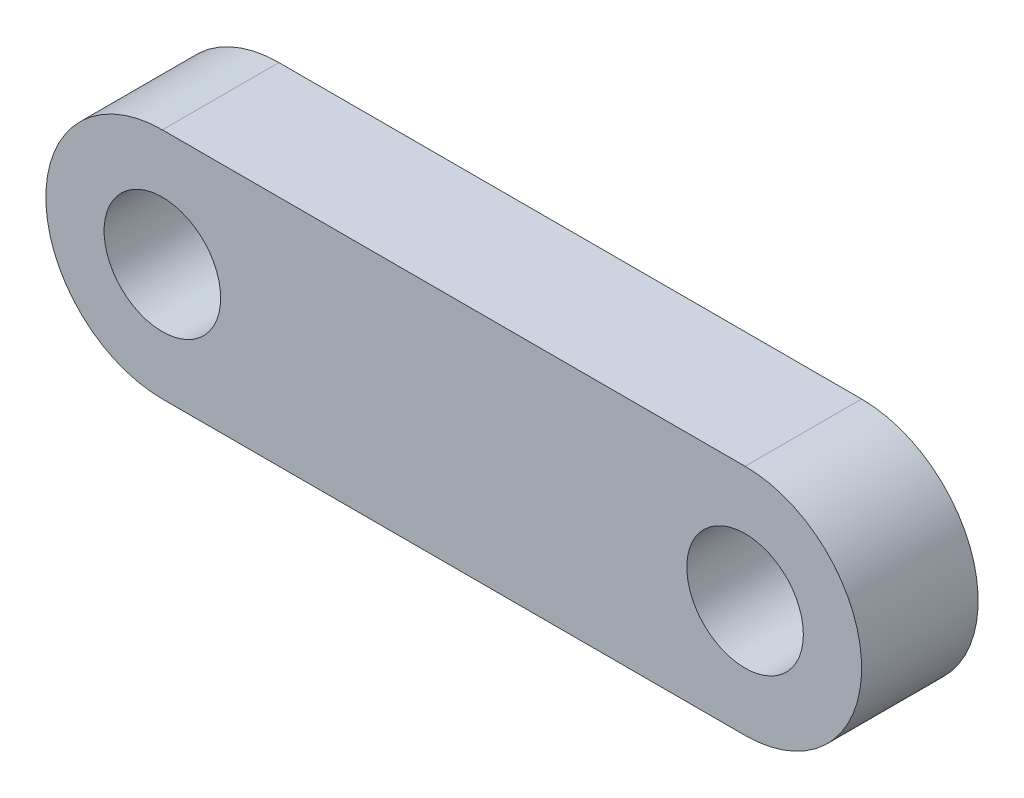
ISO-10303-21;
HEADER;
FILE_DESCRIPTION(('STEP AP214'),'2;1');
FILE_NAME('part.step','',(''),(''),'','','');
FILE_SCHEMA(('AUTOMOTIVE_DESIGN { 1 0 10303 214 1 1 1 1 }'));
ENDSEC;
DATA;
#1=APPLICATION_CONTEXT('core data for automotive mechanical design processes');
#2=APPLICATION_PROTOCOL_DEFINITION('international standard','automotive_design',2000,#1);
#3=PRODUCT_CONTEXT('',#1,'mechanical');
#4=PRODUCT('Part','Part','',(#3));
#5=PRODUCT_RELATED_PRODUCT_CATEGORY('part','',(#4));
#6=PRODUCT_DEFINITION_FORMATION('','',#4);
#7=PRODUCT_DEFINITION_CONTEXT('part definition',#1,'design');
#8=PRODUCT_DEFINITION('design','',#6,#7);
#9=PRODUCT_DEFINITION_SHAPE('','',#8);
#10=(LENGTH_UNIT() NAMED_UNIT(*) SI_UNIT(.MILLI.,.METRE.));
#11=(NAMED_UNIT(*) PLANE_ANGLE_UNIT() SI_UNIT($,.RADIAN.));
#12=(NAMED_UNIT(*) SI_UNIT($,.STERADIAN.) SOLID_ANGLE_UNIT());
#13=UNCERTAINTY_MEASURE_WITH_UNIT(LENGTH_MEASURE(1.E-05),#10,'distance_accuracy_value','');
#14=(GEOMETRIC_REPRESENTATION_CONTEXT(3) GLOBAL_UNCERTAINTY_ASSIGNED_CONTEXT((#13)) GLOBAL_UNIT_ASSIGNED_CONTEXT((#10,
#11,#12)) REPRESENTATION_CONTEXT('',''));
#15=CARTESIAN_POINT('',(0.,0.,0.));
#16=DIRECTION('',(0.,0.,1.));
#17=DIRECTION('',(1.,0.,0.));
#18=AXIS2_PLACEMENT_3D('',#15,#16,#17);
#19=CARTESIAN_POINT('',(-4.99999999334424,0.000257987588237606,2.));
#20=DIRECTION('',(0.,0.,1.));
#21=DIRECTION('',(1.,0.,0.));
#22=AXIS2_PLACEMENT_3D('',#19,#20,#21);
#23=PLANE('',#22);
#24=CARTESIAN_POINT('',(-4.99999999334424,0.000257987588237606,2.));
#25=DIRECTION('',(0.,0.,1.));
#26=DIRECTION('',(1.,0.,0.));
#27=AXIS2_PLACEMENT_3D('',#24,#25,#26);
#28=CIRCLE('',#27,1.);
#29=CARTESIAN_POINT('',(-3.99999999334424,0.000257987588237606,2.));
#30=VERTEX_POINT('',#29);
#31=EDGE_CURVE('E100',#30,#30,#28,.T.);
#32=ORIENTED_EDGE('',*,*,#31,.F.);
#33=EDGE_LOOP('',(#32));
#34=FACE_BOUND('',#33,.T.);
#35=CARTESIAN_POINT('',(-4.99999999334424,0.000257987588237606,2.));
#36=DIRECTION('',(0.,0.,1.));
#37=DIRECTION('',(1.,0.,0.));
#38=AXIS2_PLACEMENT_3D('',#35,#36,#37);
#39=CIRCLE('',#38,2.);
#40=CARTESIAN_POINT('',(-4.99999999334424,2.00025798758824,2.));
#41=VERTEX_POINT('',#40);
#42=CARTESIAN_POINT('',(-4.99999999334424,-1.99974201241176,2.));
#43=VERTEX_POINT('',#42);
#44=EDGE_CURVE('E85',#41,#43,#39,.T.);
#45=ORIENTED_EDGE('',*,*,#44,.T.);
#46=DIRECTION('',(1.,0.,0.));
#47=VECTOR('',#46,1.);
#48=CARTESIAN_POINT('',(-4.99999999334424,-1.99974201241176,2.));
#49=LINE('',#48,#47);
#50=CARTESIAN_POINT('',(5.00000000665576,-1.99974201241176,2.));
#51=VERTEX_POINT('',#50);
#52=EDGE_CURVE('E80',#43,#51,#49,.T.);
#53=ORIENTED_EDGE('',*,*,#52,.T.);
#54=CARTESIAN_POINT('',(5.00000000665576,0.000257987588237606,2.));
#55=DIRECTION('',(0.,0.,1.));
#56=DIRECTION('',(1.,0.,0.));
#57=AXIS2_PLACEMENT_3D('',#54,#55,#56);
#58=CIRCLE('',#57,2.);
#59=CARTESIAN_POINT('',(5.00000000665576,2.00025798758824,2.));
#60=VERTEX_POINT('',#59);
#61=EDGE_CURVE('E83',#51,#60,#58,.T.);
#62=ORIENTED_EDGE('',*,*,#61,.T.);
#63=DIRECTION('',(-1.,0.,0.));
#64=VECTOR('',#63,1.);
#65=CARTESIAN_POINT('',(-4.99999999334424,2.00025798758824,2.));
#66=LINE('',#65,#64);
#67=EDGE_CURVE('E50',#60,#41,#66,.T.);
#68=ORIENTED_EDGE('',*,*,#67,.T.);
#69=EDGE_LOOP('',(#45,#53,#62,#68));
#70=FACE_BOUND('',#69,.T.);
#71=CARTESIAN_POINT('',(5.00000000665576,0.000257987588237606,2.));
#72=DIRECTION('',(0.,0.,1.));
#73=DIRECTION('',(1.,0.,0.));
#74=AXIS2_PLACEMENT_3D('',#71,#72,#73);
#75=CIRCLE('',#74,1.);
#76=CARTESIAN_POINT('',(6.00000000665576,0.000257987588237606,2.));
#77=VERTEX_POINT('',#76);
#78=EDGE_CURVE('E115',#77,#77,#75,.T.);
#79=ORIENTED_EDGE('',*,*,#78,.F.);
#80=EDGE_LOOP('',(#79));
#81=FACE_BOUND('',#80,.T.);
#82=ADVANCED_FACE('F33',(#34,#70,#81),#23,.T.);
#83=CARTESIAN_POINT('',(-4.99999999334424,0.000257987588237606,0.));
#84=DIRECTION('',(0.,0.,1.));
#85=DIRECTION('',(1.,0.,0.));
#86=AXIS2_PLACEMENT_3D('',#83,#84,#85);
#87=PLANE('',#86);
#88=CARTESIAN_POINT('',(-4.99999999334424,0.000257987588237606,0.));
#89=DIRECTION('',(0.,0.,1.));
#90=DIRECTION('',(1.,0.,0.));
#91=AXIS2_PLACEMENT_3D('',#88,#89,#90);
#92=CIRCLE('',#91,2.);
#93=CARTESIAN_POINT('',(-4.99999999334424,2.00025798758824,0.));
#94=VERTEX_POINT('',#93);
#95=CARTESIAN_POINT('',(-4.99999999334424,-1.99974201241176,0.));
#96=VERTEX_POINT('',#95);
#97=EDGE_CURVE('E97',#94,#96,#92,.T.);
#98=ORIENTED_EDGE('',*,*,#97,.F.);
#99=DIRECTION('',(-1.,0.,0.));
#100=VECTOR('',#99,1.);
#101=CARTESIAN_POINT('',(-4.99999999334424,2.00025798758824,0.));
#102=LINE('',#101,#100);
#103=CARTESIAN_POINT('',(5.00000000665576,2.00025798758824,0.));
#104=VERTEX_POINT('',#103);
#105=EDGE_CURVE('E73',#104,#94,#102,.T.);
#106=ORIENTED_EDGE('',*,*,#105,.F.);
#107=CARTESIAN_POINT('',(5.00000000665576,0.000257987588237606,0.));
#108=DIRECTION('',(0.,0.,1.));
#109=DIRECTION('',(1.,0.,0.));
#110=AXIS2_PLACEMENT_3D('',#107,#108,#109);
#111=CIRCLE('',#110,2.);
#112=CARTESIAN_POINT('',(5.00000000665576,-1.99974201241176,0.));
#113=VERTEX_POINT('',#112);
#114=EDGE_CURVE('E67',#113,#104,#111,.T.);
#115=ORIENTED_EDGE('',*,*,#114,.F.);
#116=DIRECTION('',(1.,0.,0.));
#117=VECTOR('',#116,1.);
#118=CARTESIAN_POINT('',(-4.99999999334424,-1.99974201241176,0.));
#119=LINE('',#118,#117);
#120=EDGE_CURVE('E89',#96,#113,#119,.T.);
#121=ORIENTED_EDGE('',*,*,#120,.F.);
#122=EDGE_LOOP('',(#98,#106,#115,#121));
#123=FACE_BOUND('',#122,.T.);
#124=CARTESIAN_POINT('',(-4.99999999334424,0.000257987588237606,0.));
#125=DIRECTION('',(0.,0.,1.));
#126=DIRECTION('',(1.,0.,0.));
#127=AXIS2_PLACEMENT_3D('',#124,#125,#126);
#128=CIRCLE('',#127,1.);
#129=CARTESIAN_POINT('',(-3.99999999334424,0.000257987588237606,0.));
#130=VERTEX_POINT('',#129);
#131=EDGE_CURVE('E112',#130,#130,#128,.T.);
#132=ORIENTED_EDGE('',*,*,#131,.T.);
#133=EDGE_LOOP('',(#132));
#134=FACE_BOUND('',#133,.T.);
#135=CARTESIAN_POINT('',(5.00000000665576,0.000257987588237606,0.));
#136=DIRECTION('',(0.,0.,1.));
#137=DIRECTION('',(1.,0.,0.));
#138=AXIS2_PLACEMENT_3D('',#135,#136,#137);
#139=CIRCLE('',#138,1.);
#140=CARTESIAN_POINT('',(6.00000000665576,0.000257987588237606,0.));
#141=VERTEX_POINT('',#140);
#142=EDGE_CURVE('E118',#141,#141,#139,.T.);
#143=ORIENTED_EDGE('',*,*,#142,.T.);
#144=EDGE_LOOP('',(#143));
#145=FACE_BOUND('',#144,.T.);
#146=ADVANCED_FACE('F108',(#123,#134,#145),#87,.F.);
#147=CARTESIAN_POINT('',(-4.99999999334424,0.000257987588237606,2.));
#148=DIRECTION('',(0.,0.,-1.));
#149=DIRECTION('',(-1.,0.,0.));
#150=AXIS2_PLACEMENT_3D('',#147,#148,#149);
#151=CYLINDRICAL_SURFACE('',#150,2.);
#152=ORIENTED_EDGE('',*,*,#97,.T.);
#153=DIRECTION('',(0.,0.,-1.));
#154=VECTOR('',#153,1.);
#155=CARTESIAN_POINT('',(-4.99999999334424,-1.99974201241176,2.));
#156=LINE('',#155,#154);
#157=EDGE_CURVE('E11',#43,#96,#156,.T.);
#158=ORIENTED_EDGE('',*,*,#157,.F.);
#159=ORIENTED_EDGE('',*,*,#44,.F.);
#160=DIRECTION('',(0.,0.,-1.));
#161=VECTOR('',#160,1.);
#162=CARTESIAN_POINT('',(-4.99999999334424,2.00025798758824,2.));
#163=LINE('',#162,#161);
#164=EDGE_CURVE('E93',#41,#94,#163,.T.);
#165=ORIENTED_EDGE('',*,*,#164,.T.);
#166=EDGE_LOOP('',(#152,#158,#159,#165));
#167=FACE_BOUND('',#166,.T.);
#168=ADVANCED_FACE('F35',(#167),#151,.T.);
#169=CARTESIAN_POINT('',(-4.99999999334424,-1.99974201241176,2.));
#170=DIRECTION('',(0.,1.,0.));
#171=DIRECTION('',(0.,0.,1.));
#172=AXIS2_PLACEMENT_3D('',#169,#170,#171);
#173=PLANE('',#172);
#174=ORIENTED_EDGE('',*,*,#120,.T.);
#175=DIRECTION('',(0.,0.,-1.));
#176=VECTOR('',#175,1.);
#177=CARTESIAN_POINT('',(5.00000000665576,-1.99974201241176,2.));
#178=LINE('',#177,#176);
#179=EDGE_CURVE('E42',#51,#113,#178,.T.);
#180=ORIENTED_EDGE('',*,*,#179,.F.);
#181=ORIENTED_EDGE('',*,*,#52,.F.);
#182=ORIENTED_EDGE('',*,*,#157,.T.);
#183=EDGE_LOOP('',(#174,#180,#181,#182));
#184=FACE_BOUND('',#183,.T.);
#185=ADVANCED_FACE('F88',(#184),#173,.F.);
#186=CARTESIAN_POINT('',(5.00000000665576,0.000257987588237606,2.));
#187=DIRECTION('',(0.,0.,-1.));
#188=DIRECTION('',(-1.,0.,0.));
#189=AXIS2_PLACEMENT_3D('',#186,#187,#188);
#190=CYLINDRICAL_SURFACE('',#189,2.);
#191=ORIENTED_EDGE('',*,*,#114,.T.);
#192=DIRECTION('',(0.,0.,-1.));
#193=VECTOR('',#192,1.);
#194=CARTESIAN_POINT('',(5.00000000665576,2.00025798758824,2.));
#195=LINE('',#194,#193);
#196=EDGE_CURVE('E90',#60,#104,#195,.T.);
#197=ORIENTED_EDGE('',*,*,#196,.F.);
#198=ORIENTED_EDGE('',*,*,#61,.F.);
#199=ORIENTED_EDGE('',*,*,#179,.T.);
#200=EDGE_LOOP('',(#191,#197,#198,#199));
#201=FACE_BOUND('',#200,.T.);
#202=ADVANCED_FACE('F91',(#201),#190,.T.);
#203=CARTESIAN_POINT('',(-4.99999999334424,2.00025798758824,2.));
#204=DIRECTION('',(0.,-1.,0.));
#205=DIRECTION('',(0.,0.,-1.));
#206=AXIS2_PLACEMENT_3D('',#203,#204,#205);
#207=PLANE('',#206);
#208=ORIENTED_EDGE('',*,*,#105,.T.);
#209=ORIENTED_EDGE('',*,*,#164,.F.);
#210=ORIENTED_EDGE('',*,*,#67,.F.);
#211=ORIENTED_EDGE('',*,*,#196,.T.);
#212=EDGE_LOOP('',(#208,#209,#210,#211));
#213=FACE_BOUND('',#212,.T.);
#214=ADVANCED_FACE('F105',(#213),#207,.F.);
#215=CARTESIAN_POINT('',(-4.99999999334424,0.000257987588237606,2.));
#216=DIRECTION('',(0.,0.,-1.));
#217=DIRECTION('',(-1.,0.,0.));
#218=AXIS2_PLACEMENT_3D('',#215,#216,#217);
#219=CYLINDRICAL_SURFACE('',#218,1.);
#220=ORIENTED_EDGE('',*,*,#31,.T.);
#221=EDGE_LOOP('',(#220));
#222=FACE_BOUND('',#221,.T.);
#223=ORIENTED_EDGE('',*,*,#131,.F.);
#224=EDGE_LOOP('',(#223));
#225=FACE_BOUND('',#224,.T.);
#226=ADVANCED_FACE('F135',(#222,#225),#219,.F.);
#227=CARTESIAN_POINT('',(5.00000000665576,0.000257987588237606,2.));
#228=DIRECTION('',(0.,0.,-1.));
#229=DIRECTION('',(-1.,0.,0.));
#230=AXIS2_PLACEMENT_3D('',#227,#228,#229);
#231=CYLINDRICAL_SURFACE('',#230,1.);
#232=ORIENTED_EDGE('',*,*,#78,.T.);
#233=EDGE_LOOP('',(#232));
#234=FACE_BOUND('',#233,.T.);
#235=ORIENTED_EDGE('',*,*,#142,.F.);
#236=EDGE_LOOP('',(#235));
#237=FACE_BOUND('',#236,.T.);
#238=ADVANCED_FACE('F124',(#234,#237),#231,.F.);
#239=CLOSED_SHELL('',(#82,#146,#168,#185,#202,#214,#226,#238));
#240=MANIFOLD_SOLID_BREP('B2',#239);
#241=ADVANCED_BREP_SHAPE_REPRESENTATION('',(#18,#240),#14);
#242=SHAPE_DEFINITION_REPRESENTATION(#9,#241);
ENDSEC;
END-ISO-10303-21;
